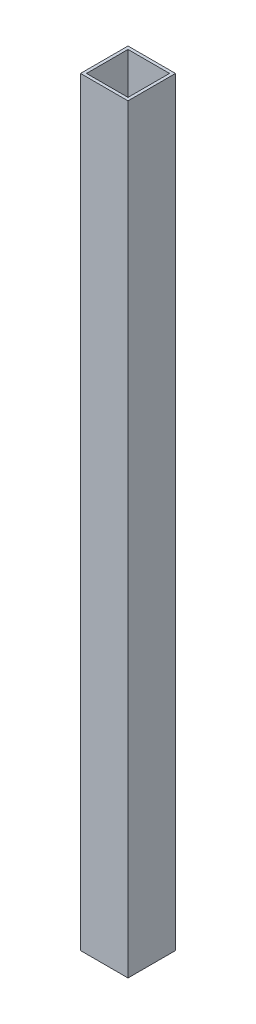
ISO-10303-21;
HEADER;
FILE_DESCRIPTION(('STEP AP214'),'2;1');
FILE_NAME('part.step','',(''),(''),'','','');
FILE_SCHEMA(('AUTOMOTIVE_DESIGN { 1 0 10303 214 1 1 1 1 }'));
ENDSEC;
DATA;
#1=APPLICATION_CONTEXT('core data for automotive mechanical design processes');
#2=APPLICATION_PROTOCOL_DEFINITION('international standard','automotive_design',2000,#1);
#3=PRODUCT_CONTEXT('',#1,'mechanical');
#4=PRODUCT('Part','Part','',(#3));
#5=PRODUCT_RELATED_PRODUCT_CATEGORY('part','',(#4));
#6=PRODUCT_DEFINITION_FORMATION('','',#4);
#7=PRODUCT_DEFINITION_CONTEXT('part definition',#1,'design');
#8=PRODUCT_DEFINITION('design','',#6,#7);
#9=PRODUCT_DEFINITION_SHAPE('','',#8);
#10=(LENGTH_UNIT() NAMED_UNIT(*) SI_UNIT(.MILLI.,.METRE.));
#11=(NAMED_UNIT(*) PLANE_ANGLE_UNIT() SI_UNIT($,.RADIAN.));
#12=(NAMED_UNIT(*) SI_UNIT($,.STERADIAN.) SOLID_ANGLE_UNIT());
#13=UNCERTAINTY_MEASURE_WITH_UNIT(LENGTH_MEASURE(1.E-05),#10,'distance_accuracy_value','');
#14=(GEOMETRIC_REPRESENTATION_CONTEXT(3) GLOBAL_UNCERTAINTY_ASSIGNED_CONTEXT((#13)) GLOBAL_UNIT_ASSIGNED_CONTEXT((#10,
#11,#12)) REPRESENTATION_CONTEXT('',''));
#15=CARTESIAN_POINT('',(0.,0.,0.));
#16=DIRECTION('',(0.,0.,1.));
#17=DIRECTION('',(1.,0.,0.));
#18=AXIS2_PLACEMENT_3D('',#15,#16,#17);
#19=CARTESIAN_POINT('',(-12.7,0.,12.7));
#20=DIRECTION('',(0.,-1.,0.));
#21=DIRECTION('',(0.,0.,-1.));
#22=AXIS2_PLACEMENT_3D('',#19,#20,#21);
#23=PLANE('',#22);
#24=DIRECTION('',(-1.,0.,0.));
#25=VECTOR('',#24,1.);
#26=CARTESIAN_POINT('',(0.,0.,11.1125));
#27=LINE('',#26,#25);
#28=CARTESIAN_POINT('',(11.1125,0.,11.1125));
#29=VERTEX_POINT('',#28);
#30=CARTESIAN_POINT('',(-11.1125,0.,11.1125));
#31=VERTEX_POINT('',#30);
#32=EDGE_CURVE('E108',#29,#31,#27,.T.);
#33=ORIENTED_EDGE('',*,*,#32,.F.);
#34=DIRECTION('',(0.,0.,1.));
#35=VECTOR('',#34,1.);
#36=CARTESIAN_POINT('',(11.1125,0.,0.));
#37=LINE('',#36,#35);
#38=CARTESIAN_POINT('',(11.1125,0.,-11.1125));
#39=VERTEX_POINT('',#38);
#40=EDGE_CURVE('E110',#39,#29,#37,.T.);
#41=ORIENTED_EDGE('',*,*,#40,.F.);
#42=DIRECTION('',(1.,0.,0.));
#43=VECTOR('',#42,1.);
#44=CARTESIAN_POINT('',(0.,0.,-11.1125));
#45=LINE('',#44,#43);
#46=CARTESIAN_POINT('',(-11.1125,0.,-11.1125));
#47=VERTEX_POINT('',#46);
#48=EDGE_CURVE('E114',#47,#39,#45,.T.);
#49=ORIENTED_EDGE('',*,*,#48,.F.);
#50=DIRECTION('',(0.,0.,-1.));
#51=VECTOR('',#50,1.);
#52=CARTESIAN_POINT('',(-11.1125,0.,0.));
#53=LINE('',#52,#51);
#54=EDGE_CURVE('E118',#31,#47,#53,.T.);
#55=ORIENTED_EDGE('',*,*,#54,.F.);
#56=EDGE_LOOP('',(#33,#41,#49,#55));
#57=FACE_BOUND('',#56,.T.);
#58=DIRECTION('',(0.,0.,1.));
#59=VECTOR('',#58,1.);
#60=CARTESIAN_POINT('',(12.7,0.,0.));
#61=LINE('',#60,#59);
#62=CARTESIAN_POINT('',(12.7,0.,-12.7));
#63=VERTEX_POINT('',#62);
#64=CARTESIAN_POINT('',(12.7,0.,12.7));
#65=VERTEX_POINT('',#64);
#66=EDGE_CURVE('E78',#63,#65,#61,.T.);
#67=ORIENTED_EDGE('',*,*,#66,.T.);
#68=DIRECTION('',(-1.,0.,0.));
#69=VECTOR('',#68,1.);
#70=CARTESIAN_POINT('',(0.,0.,12.7));
#71=LINE('',#70,#69);
#72=CARTESIAN_POINT('',(-12.7,0.,12.7));
#73=VERTEX_POINT('',#72);
#74=EDGE_CURVE('E100',#65,#73,#71,.T.);
#75=ORIENTED_EDGE('',*,*,#74,.T.);
#76=DIRECTION('',(0.,0.,-1.));
#77=VECTOR('',#76,1.);
#78=CARTESIAN_POINT('',(-12.7,0.,0.));
#79=LINE('',#78,#77);
#80=CARTESIAN_POINT('',(-12.7,0.,-12.7));
#81=VERTEX_POINT('',#80);
#82=EDGE_CURVE('E82',#73,#81,#79,.T.);
#83=ORIENTED_EDGE('',*,*,#82,.T.);
#84=DIRECTION('',(1.,0.,0.));
#85=VECTOR('',#84,1.);
#86=CARTESIAN_POINT('',(0.,0.,-12.7));
#87=LINE('',#86,#85);
#88=EDGE_CURVE('E20',#81,#63,#87,.T.);
#89=ORIENTED_EDGE('',*,*,#88,.T.);
#90=EDGE_LOOP('',(#67,#75,#83,#89));
#91=FACE_BOUND('',#90,.T.);
#92=ADVANCED_FACE('F16',(#57,#91),#23,.T.);
#93=CARTESIAN_POINT('',(-12.7,0.,-12.7));
#94=DIRECTION('',(0.,0.,1.));
#95=DIRECTION('',(1.,0.,0.));
#96=AXIS2_PLACEMENT_3D('',#93,#94,#95);
#97=PLANE('',#96);
#98=DIRECTION('',(0.,1.,0.));
#99=VECTOR('',#98,1.);
#100=CARTESIAN_POINT('',(-12.7,203.2,-12.7));
#101=LINE('',#100,#99);
#102=CARTESIAN_POINT('',(-12.7,406.4,-12.7));
#103=VERTEX_POINT('',#102);
#104=EDGE_CURVE('E102',#81,#103,#101,.T.);
#105=ORIENTED_EDGE('',*,*,#104,.T.);
#106=DIRECTION('',(1.,0.,0.));
#107=VECTOR('',#106,1.);
#108=CARTESIAN_POINT('',(0.,406.4,-12.7));
#109=LINE('',#108,#107);
#110=CARTESIAN_POINT('',(12.7,406.4,-12.7));
#111=VERTEX_POINT('',#110);
#112=EDGE_CURVE('E97',#103,#111,#109,.T.);
#113=ORIENTED_EDGE('',*,*,#112,.T.);
#114=DIRECTION('',(0.,-1.,0.));
#115=VECTOR('',#114,1.);
#116=CARTESIAN_POINT('',(12.7,203.2,-12.7));
#117=LINE('',#116,#115);
#118=EDGE_CURVE('E87',#111,#63,#117,.T.);
#119=ORIENTED_EDGE('',*,*,#118,.T.);
#120=ORIENTED_EDGE('',*,*,#88,.F.);
#121=EDGE_LOOP('',(#105,#113,#119,#120));
#122=FACE_BOUND('',#121,.T.);
#123=ADVANCED_FACE('F96',(#122),#97,.F.);
#124=CARTESIAN_POINT('',(12.7,0.,-12.7));
#125=DIRECTION('',(-1.,0.,0.));
#126=DIRECTION('',(0.,0.,1.));
#127=AXIS2_PLACEMENT_3D('',#124,#125,#126);
#128=PLANE('',#127);
#129=ORIENTED_EDGE('',*,*,#118,.F.);
#130=DIRECTION('',(0.,0.,1.));
#131=VECTOR('',#130,1.);
#132=CARTESIAN_POINT('',(12.7,406.4,0.));
#133=LINE('',#132,#131);
#134=CARTESIAN_POINT('',(12.7,406.4,12.7));
#135=VERTEX_POINT('',#134);
#136=EDGE_CURVE('E125',#111,#135,#133,.T.);
#137=ORIENTED_EDGE('',*,*,#136,.T.);
#138=DIRECTION('',(0.,-1.,0.));
#139=VECTOR('',#138,1.);
#140=CARTESIAN_POINT('',(12.7,203.2,12.7));
#141=LINE('',#140,#139);
#142=EDGE_CURVE('E93',#135,#65,#141,.T.);
#143=ORIENTED_EDGE('',*,*,#142,.T.);
#144=ORIENTED_EDGE('',*,*,#66,.F.);
#145=EDGE_LOOP('',(#129,#137,#143,#144));
#146=FACE_BOUND('',#145,.T.);
#147=ADVANCED_FACE('F90',(#146),#128,.F.);
#148=CARTESIAN_POINT('',(12.7,0.,12.7));
#149=DIRECTION('',(0.,0.,-1.));
#150=DIRECTION('',(-1.,0.,0.));
#151=AXIS2_PLACEMENT_3D('',#148,#149,#150);
#152=PLANE('',#151);
#153=ORIENTED_EDGE('',*,*,#142,.F.);
#154=DIRECTION('',(-1.,0.,0.));
#155=VECTOR('',#154,1.);
#156=CARTESIAN_POINT('',(0.,406.4,12.7));
#157=LINE('',#156,#155);
#158=CARTESIAN_POINT('',(-12.7,406.4,12.7));
#159=VERTEX_POINT('',#158);
#160=EDGE_CURVE('E127',#135,#159,#157,.T.);
#161=ORIENTED_EDGE('',*,*,#160,.T.);
#162=DIRECTION('',(0.,-1.,0.));
#163=VECTOR('',#162,1.);
#164=CARTESIAN_POINT('',(-12.7,203.2,12.7));
#165=LINE('',#164,#163);
#166=EDGE_CURVE('E104',#159,#73,#165,.T.);
#167=ORIENTED_EDGE('',*,*,#166,.T.);
#168=ORIENTED_EDGE('',*,*,#74,.F.);
#169=EDGE_LOOP('',(#153,#161,#167,#168));
#170=FACE_BOUND('',#169,.T.);
#171=ADVANCED_FACE('F172',(#170),#152,.F.);
#172=CARTESIAN_POINT('',(-12.7,0.,12.7));
#173=DIRECTION('',(1.,0.,0.));
#174=DIRECTION('',(0.,0.,-1.));
#175=AXIS2_PLACEMENT_3D('',#172,#173,#174);
#176=PLANE('',#175);
#177=ORIENTED_EDGE('',*,*,#166,.F.);
#178=DIRECTION('',(0.,0.,-1.));
#179=VECTOR('',#178,1.);
#180=CARTESIAN_POINT('',(-12.7,406.4,0.));
#181=LINE('',#180,#179);
#182=EDGE_CURVE('E130',#159,#103,#181,.T.);
#183=ORIENTED_EDGE('',*,*,#182,.T.);
#184=ORIENTED_EDGE('',*,*,#104,.F.);
#185=ORIENTED_EDGE('',*,*,#82,.F.);
#186=EDGE_LOOP('',(#177,#183,#184,#185));
#187=FACE_BOUND('',#186,.T.);
#188=ADVANCED_FACE('F169',(#187),#176,.F.);
#189=CARTESIAN_POINT('',(11.1125,0.,11.1125));
#190=DIRECTION('',(0.,0.,-1.));
#191=DIRECTION('',(-1.,0.,0.));
#192=AXIS2_PLACEMENT_3D('',#189,#190,#191);
#193=PLANE('',#192);
#194=DIRECTION('',(1.,0.,0.));
#195=VECTOR('',#194,1.);
#196=CARTESIAN_POINT('',(0.,406.4,11.1125));
#197=LINE('',#196,#195);
#198=CARTESIAN_POINT('',(-11.1125,406.4,11.1125));
#199=VERTEX_POINT('',#198);
#200=CARTESIAN_POINT('',(11.1125,406.4,11.1125));
#201=VERTEX_POINT('',#200);
#202=EDGE_CURVE('E133',#199,#201,#197,.T.);
#203=ORIENTED_EDGE('',*,*,#202,.T.);
#204=DIRECTION('',(0.,1.,0.));
#205=VECTOR('',#204,1.);
#206=CARTESIAN_POINT('',(11.1125,203.2,11.1125));
#207=LINE('',#206,#205);
#208=EDGE_CURVE('E112',#29,#201,#207,.T.);
#209=ORIENTED_EDGE('',*,*,#208,.F.);
#210=ORIENTED_EDGE('',*,*,#32,.T.);
#211=DIRECTION('',(0.,-1.,0.));
#212=VECTOR('',#211,1.);
#213=CARTESIAN_POINT('',(-11.1125,203.2,11.1125));
#214=LINE('',#213,#212);
#215=EDGE_CURVE('E121',#199,#31,#214,.T.);
#216=ORIENTED_EDGE('',*,*,#215,.F.);
#217=EDGE_LOOP('',(#203,#209,#210,#216));
#218=FACE_BOUND('',#217,.T.);
#219=ADVANCED_FACE('F153',(#218),#193,.T.);
#220=CARTESIAN_POINT('',(11.1125,0.,-11.1125));
#221=DIRECTION('',(-1.,0.,0.));
#222=DIRECTION('',(0.,0.,1.));
#223=AXIS2_PLACEMENT_3D('',#220,#221,#222);
#224=PLANE('',#223);
#225=DIRECTION('',(0.,0.,-1.));
#226=VECTOR('',#225,1.);
#227=CARTESIAN_POINT('',(11.1125,406.4,0.));
#228=LINE('',#227,#226);
#229=CARTESIAN_POINT('',(11.1125,406.4,-11.1125));
#230=VERTEX_POINT('',#229);
#231=EDGE_CURVE('E136',#201,#230,#228,.T.);
#232=ORIENTED_EDGE('',*,*,#231,.T.);
#233=DIRECTION('',(0.,1.,0.));
#234=VECTOR('',#233,1.);
#235=CARTESIAN_POINT('',(11.1125,203.2,-11.1125));
#236=LINE('',#235,#234);
#237=EDGE_CURVE('E116',#39,#230,#236,.T.);
#238=ORIENTED_EDGE('',*,*,#237,.F.);
#239=ORIENTED_EDGE('',*,*,#40,.T.);
#240=ORIENTED_EDGE('',*,*,#208,.T.);
#241=EDGE_LOOP('',(#232,#238,#239,#240));
#242=FACE_BOUND('',#241,.T.);
#243=ADVANCED_FACE('F148',(#242),#224,.T.);
#244=CARTESIAN_POINT('',(-11.1125,0.,-11.1125));
#245=DIRECTION('',(0.,0.,1.));
#246=DIRECTION('',(1.,0.,0.));
#247=AXIS2_PLACEMENT_3D('',#244,#245,#246);
#248=PLANE('',#247);
#249=DIRECTION('',(-1.,0.,0.));
#250=VECTOR('',#249,1.);
#251=CARTESIAN_POINT('',(0.,406.4,-11.1125));
#252=LINE('',#251,#250);
#253=CARTESIAN_POINT('',(-11.1125,406.4,-11.1125));
#254=VERTEX_POINT('',#253);
#255=EDGE_CURVE('E26',#230,#254,#252,.T.);
#256=ORIENTED_EDGE('',*,*,#255,.T.);
#257=DIRECTION('',(0.,1.,0.));
#258=VECTOR('',#257,1.);
#259=CARTESIAN_POINT('',(-11.1125,203.2,-11.1125));
#260=LINE('',#259,#258);
#261=EDGE_CURVE('E34',#47,#254,#260,.T.);
#262=ORIENTED_EDGE('',*,*,#261,.F.);
#263=ORIENTED_EDGE('',*,*,#48,.T.);
#264=ORIENTED_EDGE('',*,*,#237,.T.);
#265=EDGE_LOOP('',(#256,#262,#263,#264));
#266=FACE_BOUND('',#265,.T.);
#267=ADVANCED_FACE('F142',(#266),#248,.T.);
#268=CARTESIAN_POINT('',(-11.1125,0.,11.1125));
#269=DIRECTION('',(1.,0.,0.));
#270=DIRECTION('',(0.,0.,-1.));
#271=AXIS2_PLACEMENT_3D('',#268,#269,#270);
#272=PLANE('',#271);
#273=DIRECTION('',(0.,0.,1.));
#274=VECTOR('',#273,1.);
#275=CARTESIAN_POINT('',(-11.1125,406.4,0.));
#276=LINE('',#275,#274);
#277=EDGE_CURVE('E11',#254,#199,#276,.T.);
#278=ORIENTED_EDGE('',*,*,#277,.T.);
#279=ORIENTED_EDGE('',*,*,#215,.T.);
#280=ORIENTED_EDGE('',*,*,#54,.T.);
#281=ORIENTED_EDGE('',*,*,#261,.T.);
#282=EDGE_LOOP('',(#278,#279,#280,#281));
#283=FACE_BOUND('',#282,.T.);
#284=ADVANCED_FACE('F156',(#283),#272,.T.);
#285=CARTESIAN_POINT('',(-12.7,406.4,12.7));
#286=DIRECTION('',(0.,-1.,0.));
#287=DIRECTION('',(0.,0.,-1.));
#288=AXIS2_PLACEMENT_3D('',#285,#286,#287);
#289=PLANE('',#288);
#290=ORIENTED_EDGE('',*,*,#255,.F.);
#291=ORIENTED_EDGE('',*,*,#231,.F.);
#292=ORIENTED_EDGE('',*,*,#202,.F.);
#293=ORIENTED_EDGE('',*,*,#277,.F.);
#294=EDGE_LOOP('',(#290,#291,#292,#293));
#295=FACE_BOUND('',#294,.T.);
#296=ORIENTED_EDGE('',*,*,#160,.F.);
#297=ORIENTED_EDGE('',*,*,#136,.F.);
#298=ORIENTED_EDGE('',*,*,#112,.F.);
#299=ORIENTED_EDGE('',*,*,#182,.F.);
#300=EDGE_LOOP('',(#296,#297,#298,#299));
#301=FACE_BOUND('',#300,.T.);
#302=ADVANCED_FACE('F18',(#295,#301),#289,.F.);
#303=CLOSED_SHELL('',(#92,#123,#147,#171,#188,#219,#243,#267,#284,#302));
#304=MANIFOLD_SOLID_BREP('B1',#303);
#305=ADVANCED_BREP_SHAPE_REPRESENTATION('',(#18,#304),#14);
#306=SHAPE_DEFINITION_REPRESENTATION(#9,#305);
ENDSEC;
END-ISO-10303-21;
